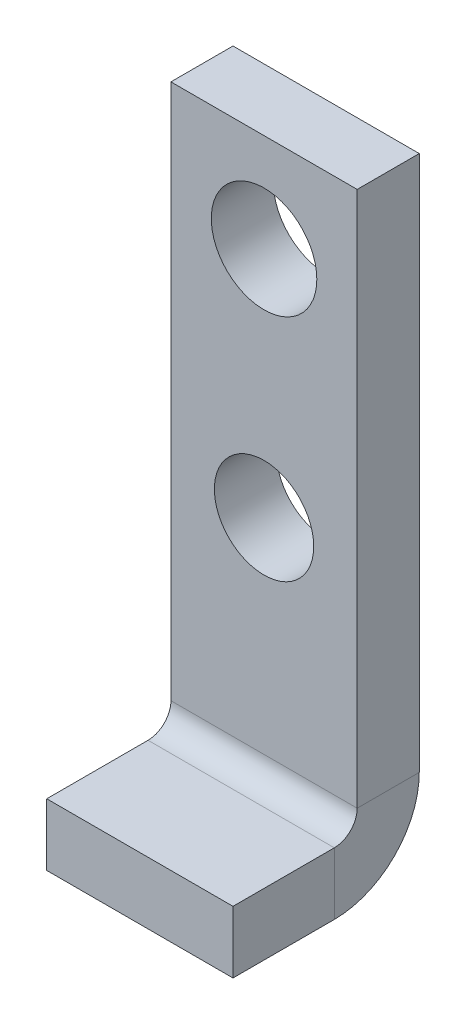
ISO-10303-21;
HEADER;
FILE_DESCRIPTION(('STEP AP214'),'2;1');
FILE_NAME('part.step','',(''),(''),'','','');
FILE_SCHEMA(('AUTOMOTIVE_DESIGN { 1 0 10303 214 1 1 1 1 }'));
ENDSEC;
DATA;
#1=APPLICATION_CONTEXT('core data for automotive mechanical design processes');
#2=APPLICATION_PROTOCOL_DEFINITION('international standard','automotive_design',2000,#1);
#3=PRODUCT_CONTEXT('',#1,'mechanical');
#4=PRODUCT('Part','Part','',(#3));
#5=PRODUCT_RELATED_PRODUCT_CATEGORY('part','',(#4));
#6=PRODUCT_DEFINITION_FORMATION('','',#4);
#7=PRODUCT_DEFINITION_CONTEXT('part definition',#1,'design');
#8=PRODUCT_DEFINITION('design','',#6,#7);
#9=PRODUCT_DEFINITION_SHAPE('','',#8);
#10=(LENGTH_UNIT() NAMED_UNIT(*) SI_UNIT(.MILLI.,.METRE.));
#11=(NAMED_UNIT(*) PLANE_ANGLE_UNIT() SI_UNIT($,.RADIAN.));
#12=(NAMED_UNIT(*) SI_UNIT($,.STERADIAN.) SOLID_ANGLE_UNIT());
#13=UNCERTAINTY_MEASURE_WITH_UNIT(LENGTH_MEASURE(1.E-05),#10,'distance_accuracy_value','');
#14=(GEOMETRIC_REPRESENTATION_CONTEXT(3) GLOBAL_UNCERTAINTY_ASSIGNED_CONTEXT((#13)) GLOBAL_UNIT_ASSIGNED_CONTEXT((#10,
#11,#12)) REPRESENTATION_CONTEXT('',''));
#15=CARTESIAN_POINT('',(0.,0.,0.));
#16=DIRECTION('',(0.,0.,1.));
#17=DIRECTION('',(1.,0.,0.));
#18=AXIS2_PLACEMENT_3D('',#15,#16,#17);
#19=CARTESIAN_POINT('',(3.,10.6596766614091,-2.));
#20=DIRECTION('',(1.,0.,0.));
#21=DIRECTION('',(0.,1.,0.));
#22=AXIS2_PLACEMENT_3D('',#19,#20,#21);
#23=PLANE('',#22);
#24=DIRECTION('',(0.,1.,0.));
#25=VECTOR('',#24,1.);
#26=CARTESIAN_POINT('',(3.,10.6596766614091,0.));
#27=LINE('',#26,#25);
#28=CARTESIAN_POINT('',(3.,-6.60372333859085,0.));
#29=VERTEX_POINT('',#28);
#30=CARTESIAN_POINT('',(3.,10.6596766614091,0.));
#31=VERTEX_POINT('',#30);
#32=EDGE_CURVE('E84',#29,#31,#27,.T.);
#33=ORIENTED_EDGE('',*,*,#32,.F.);
#34=DIRECTION('',(0.,0.,-1.));
#35=VECTOR('',#34,1.);
#36=CARTESIAN_POINT('',(3.,-6.60372333859085,0.));
#37=LINE('',#36,#35);
#38=CARTESIAN_POINT('',(3.,-6.60372333859085,-2.));
#39=VERTEX_POINT('',#38);
#40=EDGE_CURVE('E108',#29,#39,#37,.T.);
#41=ORIENTED_EDGE('',*,*,#40,.T.);
#42=DIRECTION('',(0.,1.,0.));
#43=VECTOR('',#42,1.);
#44=CARTESIAN_POINT('',(3.,10.6596766614091,-2.));
#45=LINE('',#44,#43);
#46=CARTESIAN_POINT('',(3.,10.6596766614091,-2.));
#47=VERTEX_POINT('',#46);
#48=EDGE_CURVE('E91',#39,#47,#45,.T.);
#49=ORIENTED_EDGE('',*,*,#48,.T.);
#50=DIRECTION('',(0.,0.,1.));
#51=VECTOR('',#50,1.);
#52=CARTESIAN_POINT('',(3.,10.6596766614091,-2.));
#53=LINE('',#52,#51);
#54=EDGE_CURVE('E43',#47,#31,#53,.T.);
#55=ORIENTED_EDGE('',*,*,#54,.T.);
#56=EDGE_LOOP('',(#33,#41,#49,#55));
#57=FACE_BOUND('',#56,.T.);
#58=ADVANCED_FACE('F39',(#57),#23,.T.);
#59=CARTESIAN_POINT('',(0.,0.,-2.));
#60=DIRECTION('',(0.,0.,1.));
#61=DIRECTION('',(1.,0.,0.));
#62=AXIS2_PLACEMENT_3D('',#59,#60,#61);
#63=PLANE('',#62);
#64=CARTESIAN_POINT('',(0.,0.,-2.));
#65=DIRECTION('',(0.,0.,1.));
#66=DIRECTION('',(1.,0.,0.));
#67=AXIS2_PLACEMENT_3D('',#64,#65,#66);
#68=CIRCLE('',#67,1.6);
#69=CARTESIAN_POINT('',(1.6,0.,-2.));
#70=VERTEX_POINT('',#69);
#71=EDGE_CURVE('E85',#70,#70,#68,.T.);
#72=ORIENTED_EDGE('',*,*,#71,.T.);
#73=EDGE_LOOP('',(#72));
#74=FACE_BOUND('',#73,.T.);
#75=CARTESIAN_POINT('',(0.,7.5,-2.));
#76=DIRECTION('',(0.,0.,1.));
#77=DIRECTION('',(1.,0.,0.));
#78=AXIS2_PLACEMENT_3D('',#75,#76,#77);
#79=CIRCLE('',#78,1.7);
#80=CARTESIAN_POINT('',(1.7,7.5,-2.));
#81=VERTEX_POINT('',#80);
#82=EDGE_CURVE('E100',#81,#81,#79,.T.);
#83=ORIENTED_EDGE('',*,*,#82,.T.);
#84=EDGE_LOOP('',(#83));
#85=FACE_BOUND('',#84,.T.);
#86=DIRECTION('',(1.,0.,0.));
#87=VECTOR('',#86,1.);
#88=CARTESIAN_POINT('',(3.,-6.60372333859085,-2.));
#89=LINE('',#88,#87);
#90=CARTESIAN_POINT('',(-3.,-6.60372333859084,-2.));
#91=VERTEX_POINT('',#90);
#92=EDGE_CURVE('E124',#39,#91,#89,.F.);
#93=ORIENTED_EDGE('',*,*,#92,.T.);
#94=DIRECTION('',(0.,-1.,0.));
#95=VECTOR('',#94,1.);
#96=CARTESIAN_POINT('',(-3.,10.6596766614091,-2.));
#97=LINE('',#96,#95);
#98=CARTESIAN_POINT('',(-3.,10.6596766614091,-2.));
#99=VERTEX_POINT('',#98);
#100=EDGE_CURVE('E89',#99,#91,#97,.T.);
#101=ORIENTED_EDGE('',*,*,#100,.F.);
#102=DIRECTION('',(-1.,0.,0.));
#103=VECTOR('',#102,1.);
#104=CARTESIAN_POINT('',(-3.,10.6596766614091,-2.));
#105=LINE('',#104,#103);
#106=EDGE_CURVE('E78',#47,#99,#105,.T.);
#107=ORIENTED_EDGE('',*,*,#106,.F.);
#108=ORIENTED_EDGE('',*,*,#48,.F.);
#109=EDGE_LOOP('',(#93,#101,#107,#108));
#110=FACE_BOUND('',#109,.T.);
#111=ADVANCED_FACE('F215',(#74,#85,#110),#63,.F.);
#112=CARTESIAN_POINT('',(0.,0.,0.));
#113=DIRECTION('',(0.,0.,1.));
#114=DIRECTION('',(1.,0.,0.));
#115=AXIS2_PLACEMENT_3D('',#112,#113,#114);
#116=PLANE('',#115);
#117=CARTESIAN_POINT('',(0.,7.5,0.));
#118=DIRECTION('',(0.,0.,1.));
#119=DIRECTION('',(1.,0.,0.));
#120=AXIS2_PLACEMENT_3D('',#117,#118,#119);
#121=CIRCLE('',#120,1.7);
#122=CARTESIAN_POINT('',(1.7,7.5,0.));
#123=VERTEX_POINT('',#122);
#124=EDGE_CURVE('E103',#123,#123,#121,.T.);
#125=ORIENTED_EDGE('',*,*,#124,.F.);
#126=EDGE_LOOP('',(#125));
#127=FACE_BOUND('',#126,.T.);
#128=CARTESIAN_POINT('',(0.,0.,0.));
#129=DIRECTION('',(0.,0.,1.));
#130=DIRECTION('',(1.,0.,0.));
#131=AXIS2_PLACEMENT_3D('',#128,#129,#130);
#132=CIRCLE('',#131,1.6);
#133=CARTESIAN_POINT('',(1.6,0.,0.));
#134=VERTEX_POINT('',#133);
#135=EDGE_CURVE('E97',#134,#134,#132,.T.);
#136=ORIENTED_EDGE('',*,*,#135,.F.);
#137=EDGE_LOOP('',(#136));
#138=FACE_BOUND('',#137,.T.);
#139=DIRECTION('',(0.,-1.,0.));
#140=VECTOR('',#139,1.);
#141=CARTESIAN_POINT('',(-3.,10.6596766614091,0.));
#142=LINE('',#141,#140);
#143=CARTESIAN_POINT('',(-3.,10.6596766614091,0.));
#144=VERTEX_POINT('',#143);
#145=CARTESIAN_POINT('',(-3.,-6.60372333859085,0.));
#146=VERTEX_POINT('',#145);
#147=EDGE_CURVE('E80',#144,#146,#142,.T.);
#148=ORIENTED_EDGE('',*,*,#147,.T.);
#149=DIRECTION('',(1.,0.,0.));
#150=VECTOR('',#149,1.);
#151=CARTESIAN_POINT('',(3.,-6.60372333859085,0.));
#152=LINE('',#151,#150);
#153=EDGE_CURVE('E54',#29,#146,#152,.F.);
#154=ORIENTED_EDGE('',*,*,#153,.F.);
#155=ORIENTED_EDGE('',*,*,#32,.T.);
#156=DIRECTION('',(-1.,0.,0.));
#157=VECTOR('',#156,1.);
#158=CARTESIAN_POINT('',(-3.,10.6596766614091,0.));
#159=LINE('',#158,#157);
#160=EDGE_CURVE('E76',#31,#144,#159,.T.);
#161=ORIENTED_EDGE('',*,*,#160,.T.);
#162=EDGE_LOOP('',(#148,#154,#155,#161));
#163=FACE_BOUND('',#162,.T.);
#164=ADVANCED_FACE('F87',(#127,#138,#163),#116,.T.);
#165=CARTESIAN_POINT('',(-3.,10.6596766614091,-2.));
#166=DIRECTION('',(-1.,0.,0.));
#167=DIRECTION('',(0.,-1.,0.));
#168=AXIS2_PLACEMENT_3D('',#165,#166,#167);
#169=PLANE('',#168);
#170=DIRECTION('',(0.,0.,-1.));
#171=VECTOR('',#170,1.);
#172=CARTESIAN_POINT('',(-3.,-6.60372333859085,0.));
#173=LINE('',#172,#171);
#174=EDGE_CURVE('E83',#146,#91,#173,.T.);
#175=ORIENTED_EDGE('',*,*,#174,.F.);
#176=ORIENTED_EDGE('',*,*,#147,.F.);
#177=DIRECTION('',(0.,0.,1.));
#178=VECTOR('',#177,1.);
#179=CARTESIAN_POINT('',(-3.,10.6596766614091,-2.));
#180=LINE('',#179,#178);
#181=EDGE_CURVE('E11',#99,#144,#180,.T.);
#182=ORIENTED_EDGE('',*,*,#181,.F.);
#183=ORIENTED_EDGE('',*,*,#100,.T.);
#184=EDGE_LOOP('',(#175,#176,#182,#183));
#185=FACE_BOUND('',#184,.T.);
#186=ADVANCED_FACE('F41',(#185),#169,.T.);
#187=CARTESIAN_POINT('',(-3.,10.6596766614091,-2.));
#188=DIRECTION('',(0.,1.,0.));
#189=DIRECTION('',(0.,0.,1.));
#190=AXIS2_PLACEMENT_3D('',#187,#188,#189);
#191=PLANE('',#190);
#192=ORIENTED_EDGE('',*,*,#160,.F.);
#193=ORIENTED_EDGE('',*,*,#54,.F.);
#194=ORIENTED_EDGE('',*,*,#106,.T.);
#195=ORIENTED_EDGE('',*,*,#181,.T.);
#196=EDGE_LOOP('',(#192,#193,#194,#195));
#197=FACE_BOUND('',#196,.T.);
#198=ADVANCED_FACE('F73',(#197),#191,.T.);
#199=CARTESIAN_POINT('',(0.,0.,-2.));
#200=DIRECTION('',(0.,0.,1.));
#201=DIRECTION('',(1.,0.,0.));
#202=AXIS2_PLACEMENT_3D('',#199,#200,#201);
#203=CYLINDRICAL_SURFACE('',#202,1.6);
#204=ORIENTED_EDGE('',*,*,#71,.F.);
#205=EDGE_LOOP('',(#204));
#206=FACE_BOUND('',#205,.T.);
#207=ORIENTED_EDGE('',*,*,#135,.T.);
#208=EDGE_LOOP('',(#207));
#209=FACE_BOUND('',#208,.T.);
#210=ADVANCED_FACE('F238',(#206,#209),#203,.F.);
#211=CARTESIAN_POINT('',(0.,7.5,-2.));
#212=DIRECTION('',(0.,0.,1.));
#213=DIRECTION('',(1.,0.,0.));
#214=AXIS2_PLACEMENT_3D('',#211,#212,#213);
#215=CYLINDRICAL_SURFACE('',#214,1.7);
#216=ORIENTED_EDGE('',*,*,#82,.F.);
#217=EDGE_LOOP('',(#216));
#218=FACE_BOUND('',#217,.T.);
#219=ORIENTED_EDGE('',*,*,#124,.T.);
#220=EDGE_LOOP('',(#219));
#221=FACE_BOUND('',#220,.T.);
#222=ADVANCED_FACE('F244',(#218,#221),#215,.F.);
#223=CARTESIAN_POINT('',(-3.,-6.60372333859085,0.7366));
#224=DIRECTION('',(-1.,0.,0.));
#225=DIRECTION('',(0.,0.,1.));
#226=AXIS2_PLACEMENT_3D('',#223,#224,#225);
#227=PLANE('',#226);
#228=DIRECTION('',(0.,-1.,0.));
#229=VECTOR('',#228,1.);
#230=CARTESIAN_POINT('',(-3.,-7.34032333859085,0.736599999999997));
#231=LINE('',#230,#229);
#232=CARTESIAN_POINT('',(-3.,-7.34032333859085,0.736599999999997));
#233=VERTEX_POINT('',#232);
#234=CARTESIAN_POINT('',(-3.,-9.34032333859085,0.73659999999999));
#235=VERTEX_POINT('',#234);
#236=EDGE_CURVE('E156',#233,#235,#231,.T.);
#237=ORIENTED_EDGE('',*,*,#236,.F.);
#238=CARTESIAN_POINT('',(-3.,-6.60372333859085,0.7366));
#239=DIRECTION('',(1.,0.,0.));
#240=DIRECTION('',(0.,0.,-1.));
#241=AXIS2_PLACEMENT_3D('',#238,#239,#240);
#242=CIRCLE('',#241,0.7366);
#243=EDGE_CURVE('E118',#146,#233,#242,.F.);
#244=ORIENTED_EDGE('',*,*,#243,.F.);
#245=ORIENTED_EDGE('',*,*,#174,.T.);
#246=CARTESIAN_POINT('',(-3.,-6.60372333859085,0.7366));
#247=DIRECTION('',(1.,0.,0.));
#248=DIRECTION('',(0.,0.,-1.));
#249=AXIS2_PLACEMENT_3D('',#246,#247,#248);
#250=CIRCLE('',#249,2.7366);
#251=EDGE_CURVE('E111',#91,#235,#250,.F.);
#252=ORIENTED_EDGE('',*,*,#251,.T.);
#253=EDGE_LOOP('',(#237,#244,#245,#252));
#254=FACE_BOUND('',#253,.T.);
#255=ADVANCED_FACE('F217',(#254),#227,.T.);
#256=CARTESIAN_POINT('',(3.,-6.60372333859085,0.7366));
#257=DIRECTION('',(-1.,0.,0.));
#258=DIRECTION('',(0.,0.,1.));
#259=AXIS2_PLACEMENT_3D('',#256,#257,#258);
#260=PLANE('',#259);
#261=CARTESIAN_POINT('',(3.,-6.60372333859085,0.7366));
#262=DIRECTION('',(1.,0.,0.));
#263=DIRECTION('',(0.,0.,-1.));
#264=AXIS2_PLACEMENT_3D('',#261,#262,#263);
#265=CIRCLE('',#264,0.7366);
#266=CARTESIAN_POINT('',(3.,-7.34032333859085,0.736599999999997));
#267=VERTEX_POINT('',#266);
#268=EDGE_CURVE('E113',#267,#29,#265,.T.);
#269=ORIENTED_EDGE('',*,*,#268,.F.);
#270=DIRECTION('',(0.,-1.,0.));
#271=VECTOR('',#270,1.);
#272=CARTESIAN_POINT('',(3.,-7.34032333859085,0.736599999999997));
#273=LINE('',#272,#271);
#274=CARTESIAN_POINT('',(3.,-9.34032333859085,0.73659999999999));
#275=VERTEX_POINT('',#274);
#276=EDGE_CURVE('E155',#267,#275,#273,.T.);
#277=ORIENTED_EDGE('',*,*,#276,.T.);
#278=CARTESIAN_POINT('',(3.,-6.60372333859085,0.7366));
#279=DIRECTION('',(1.,0.,0.));
#280=DIRECTION('',(0.,0.,-1.));
#281=AXIS2_PLACEMENT_3D('',#278,#279,#280);
#282=CIRCLE('',#281,2.7366);
#283=EDGE_CURVE('E121',#275,#39,#282,.T.);
#284=ORIENTED_EDGE('',*,*,#283,.T.);
#285=ORIENTED_EDGE('',*,*,#40,.F.);
#286=EDGE_LOOP('',(#269,#277,#284,#285));
#287=FACE_BOUND('',#286,.T.);
#288=ADVANCED_FACE('F178',(#287),#260,.F.);
#289=CARTESIAN_POINT('',(3.,-6.60372333859085,0.7366));
#290=DIRECTION('',(1.,0.,0.));
#291=DIRECTION('',(0.,-1.,0.));
#292=AXIS2_PLACEMENT_3D('',#289,#290,#291);
#293=CYLINDRICAL_SURFACE('',#292,2.7366);
#294=ORIENTED_EDGE('',*,*,#92,.F.);
#295=ORIENTED_EDGE('',*,*,#283,.F.);
#296=DIRECTION('',(-1.,0.,0.));
#297=VECTOR('',#296,1.);
#298=CARTESIAN_POINT('',(0.,-9.34032333859085,0.73659999999999));
#299=LINE('',#298,#297);
#300=EDGE_CURVE('E145',#275,#235,#299,.T.);
#301=ORIENTED_EDGE('',*,*,#300,.T.);
#302=ORIENTED_EDGE('',*,*,#251,.F.);
#303=EDGE_LOOP('',(#294,#295,#301,#302));
#304=FACE_BOUND('',#303,.T.);
#305=ADVANCED_FACE('F218',(#304),#293,.T.);
#306=CARTESIAN_POINT('',(3.,-6.60372333859085,0.7366));
#307=DIRECTION('',(1.,0.,0.));
#308=DIRECTION('',(0.,-1.,0.));
#309=AXIS2_PLACEMENT_3D('',#306,#307,#308);
#310=CYLINDRICAL_SURFACE('',#309,0.7366);
#311=ORIENTED_EDGE('',*,*,#153,.T.);
#312=ORIENTED_EDGE('',*,*,#243,.T.);
#313=DIRECTION('',(1.,0.,0.));
#314=VECTOR('',#313,1.);
#315=CARTESIAN_POINT('',(-3.,-7.34032333859085,0.736599999999997));
#316=LINE('',#315,#314);
#317=EDGE_CURVE('E159',#233,#267,#316,.T.);
#318=ORIENTED_EDGE('',*,*,#317,.T.);
#319=ORIENTED_EDGE('',*,*,#268,.T.);
#320=EDGE_LOOP('',(#311,#312,#318,#319));
#321=FACE_BOUND('',#320,.T.);
#322=ADVANCED_FACE('F167',(#321),#310,.F.);
#323=CARTESIAN_POINT('',(-3.,-9.34032333859085,0.));
#324=DIRECTION('',(1.,0.,0.));
#325=DIRECTION('',(0.,0.,-1.));
#326=AXIS2_PLACEMENT_3D('',#323,#324,#325);
#327=PLANE('',#326);
#328=ORIENTED_EDGE('',*,*,#236,.T.);
#329=DIRECTION('',(0.,0.,-1.));
#330=VECTOR('',#329,1.);
#331=CARTESIAN_POINT('',(-3.,-9.34032333859085,0.));
#332=LINE('',#331,#330);
#333=CARTESIAN_POINT('',(-3.,-9.34032333859087,3.99999999999999));
#334=VERTEX_POINT('',#333);
#335=EDGE_CURVE('E138',#334,#235,#332,.T.);
#336=ORIENTED_EDGE('',*,*,#335,.F.);
#337=DIRECTION('',(0.,1.,0.));
#338=VECTOR('',#337,1.);
#339=CARTESIAN_POINT('',(-3.,-9.34032333859087,3.99999999999999));
#340=LINE('',#339,#338);
#341=CARTESIAN_POINT('',(-3.,-7.34032333859086,4.));
#342=VERTEX_POINT('',#341);
#343=EDGE_CURVE('E131',#334,#342,#340,.T.);
#344=ORIENTED_EDGE('',*,*,#343,.T.);
#345=DIRECTION('',(0.,0.,-1.));
#346=VECTOR('',#345,1.);
#347=CARTESIAN_POINT('',(-3.,-7.34032333859085,0.));
#348=LINE('',#347,#346);
#349=EDGE_CURVE('E142',#342,#233,#348,.T.);
#350=ORIENTED_EDGE('',*,*,#349,.T.);
#351=EDGE_LOOP('',(#328,#336,#344,#350));
#352=FACE_BOUND('',#351,.T.);
#353=ADVANCED_FACE('F199',(#352),#327,.F.);
#354=CARTESIAN_POINT('',(3.,-9.34032333859087,3.99999999999999));
#355=DIRECTION('',(-1.,0.,0.));
#356=DIRECTION('',(0.,0.,1.));
#357=AXIS2_PLACEMENT_3D('',#354,#355,#356);
#358=PLANE('',#357);
#359=ORIENTED_EDGE('',*,*,#276,.F.);
#360=DIRECTION('',(0.,0.,1.));
#361=VECTOR('',#360,1.);
#362=CARTESIAN_POINT('',(3.,-7.34032333859086,4.));
#363=LINE('',#362,#361);
#364=CARTESIAN_POINT('',(3.,-7.34032333859086,4.));
#365=VERTEX_POINT('',#364);
#366=EDGE_CURVE('E139',#267,#365,#363,.T.);
#367=ORIENTED_EDGE('',*,*,#366,.T.);
#368=DIRECTION('',(0.,1.,0.));
#369=VECTOR('',#368,1.);
#370=CARTESIAN_POINT('',(3.,-9.34032333859087,3.99999999999999));
#371=LINE('',#370,#369);
#372=CARTESIAN_POINT('',(3.,-9.34032333859087,3.99999999999999));
#373=VERTEX_POINT('',#372);
#374=EDGE_CURVE('E116',#373,#365,#371,.T.);
#375=ORIENTED_EDGE('',*,*,#374,.F.);
#376=DIRECTION('',(0.,0.,1.));
#377=VECTOR('',#376,1.);
#378=CARTESIAN_POINT('',(3.,-9.34032333859087,3.99999999999999));
#379=LINE('',#378,#377);
#380=EDGE_CURVE('E148',#275,#373,#379,.T.);
#381=ORIENTED_EDGE('',*,*,#380,.F.);
#382=EDGE_LOOP('',(#359,#367,#375,#381));
#383=FACE_BOUND('',#382,.T.);
#384=ADVANCED_FACE('F183',(#383),#358,.F.);
#385=CARTESIAN_POINT('',(0.,-9.34032333859085,0.));
#386=DIRECTION('',(0.,1.,0.));
#387=DIRECTION('',(0.,0.,1.));
#388=AXIS2_PLACEMENT_3D('',#385,#386,#387);
#389=PLANE('',#388);
#390=ORIENTED_EDGE('',*,*,#300,.F.);
#391=ORIENTED_EDGE('',*,*,#380,.T.);
#392=DIRECTION('',(-1.,0.,0.));
#393=VECTOR('',#392,1.);
#394=CARTESIAN_POINT('',(-3.,-9.34032333859087,3.99999999999999));
#395=LINE('',#394,#393);
#396=EDGE_CURVE('E134',#373,#334,#395,.T.);
#397=ORIENTED_EDGE('',*,*,#396,.T.);
#398=ORIENTED_EDGE('',*,*,#335,.T.);
#399=EDGE_LOOP('',(#390,#391,#397,#398));
#400=FACE_BOUND('',#399,.T.);
#401=ADVANCED_FACE('F203',(#400),#389,.F.);
#402=CARTESIAN_POINT('',(0.,-7.34032333859085,0.));
#403=DIRECTION('',(0.,1.,0.));
#404=DIRECTION('',(0.,0.,1.));
#405=AXIS2_PLACEMENT_3D('',#402,#403,#404);
#406=PLANE('',#405);
#407=ORIENTED_EDGE('',*,*,#366,.F.);
#408=ORIENTED_EDGE('',*,*,#317,.F.);
#409=ORIENTED_EDGE('',*,*,#349,.F.);
#410=DIRECTION('',(-1.,0.,0.));
#411=VECTOR('',#410,1.);
#412=CARTESIAN_POINT('',(-3.,-7.34032333859086,4.));
#413=LINE('',#412,#411);
#414=EDGE_CURVE('E135',#365,#342,#413,.T.);
#415=ORIENTED_EDGE('',*,*,#414,.F.);
#416=EDGE_LOOP('',(#407,#408,#409,#415));
#417=FACE_BOUND('',#416,.T.);
#418=ADVANCED_FACE('F187',(#417),#406,.T.);
#419=CARTESIAN_POINT('',(-3.,-9.34032333859087,3.99999999999999));
#420=DIRECTION('',(0.,0.,-1.));
#421=DIRECTION('',(0.,1.,0.));
#422=AXIS2_PLACEMENT_3D('',#419,#420,#421);
#423=PLANE('',#422);
#424=ORIENTED_EDGE('',*,*,#414,.T.);
#425=ORIENTED_EDGE('',*,*,#343,.F.);
#426=ORIENTED_EDGE('',*,*,#396,.F.);
#427=ORIENTED_EDGE('',*,*,#374,.T.);
#428=EDGE_LOOP('',(#424,#425,#426,#427));
#429=FACE_BOUND('',#428,.T.);
#430=ADVANCED_FACE('F192',(#429),#423,.F.);
#431=CLOSED_SHELL('',(#58,#111,#164,#186,#198,#210,#222,#255,#288,#305,#322,#353,#384,#401,#418,#430));
#432=MANIFOLD_SOLID_BREP('B2',#431);
#433=ADVANCED_BREP_SHAPE_REPRESENTATION('',(#18,#432),#14);
#434=SHAPE_DEFINITION_REPRESENTATION(#9,#433);
ENDSEC;
END-ISO-10303-21;
